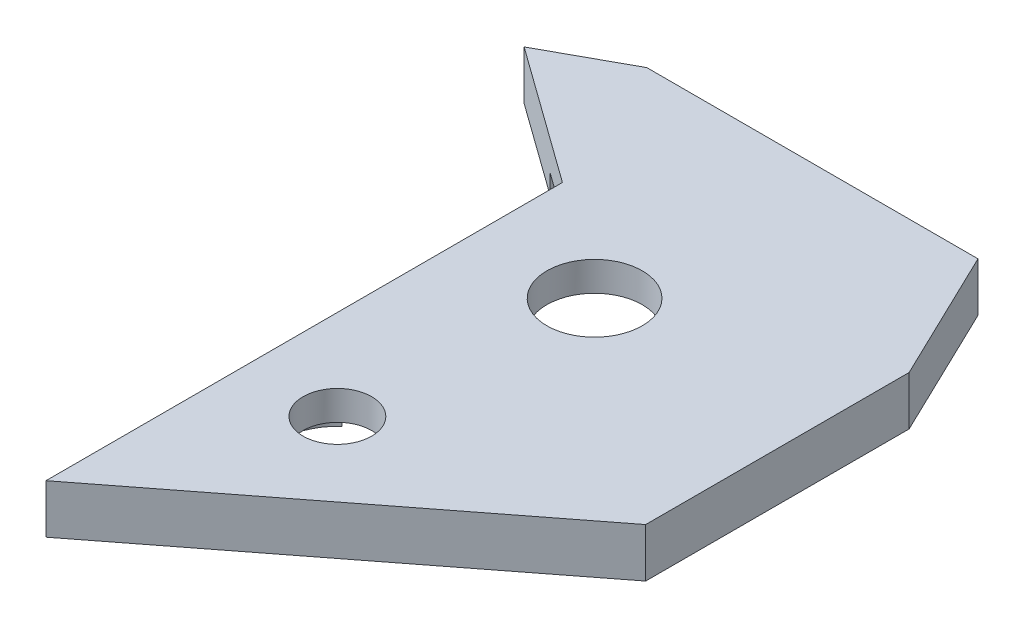
ISO-10303-21;
HEADER;
FILE_DESCRIPTION(('STEP AP214'),'2;1');
FILE_NAME('part.step','',(''),(''),'','','');
FILE_SCHEMA(('AUTOMOTIVE_DESIGN { 1 0 10303 214 1 1 1 1 }'));
ENDSEC;
DATA;
#1=APPLICATION_CONTEXT('core data for automotive mechanical design processes');
#2=APPLICATION_PROTOCOL_DEFINITION('international standard','automotive_design',2000,#1);
#3=PRODUCT_CONTEXT('',#1,'mechanical');
#4=PRODUCT('Part','Part','',(#3));
#5=PRODUCT_RELATED_PRODUCT_CATEGORY('part','',(#4));
#6=PRODUCT_DEFINITION_FORMATION('','',#4);
#7=PRODUCT_DEFINITION_CONTEXT('part definition',#1,'design');
#8=PRODUCT_DEFINITION('design','',#6,#7);
#9=PRODUCT_DEFINITION_SHAPE('','',#8);
#10=(LENGTH_UNIT() NAMED_UNIT(*) SI_UNIT(.MILLI.,.METRE.));
#11=(NAMED_UNIT(*) PLANE_ANGLE_UNIT() SI_UNIT($,.RADIAN.));
#12=(NAMED_UNIT(*) SI_UNIT($,.STERADIAN.) SOLID_ANGLE_UNIT());
#13=UNCERTAINTY_MEASURE_WITH_UNIT(LENGTH_MEASURE(1.E-05),#10,'distance_accuracy_value','');
#14=(GEOMETRIC_REPRESENTATION_CONTEXT(3) GLOBAL_UNCERTAINTY_ASSIGNED_CONTEXT((#13)) GLOBAL_UNIT_ASSIGNED_CONTEXT((#10,
#11,#12)) REPRESENTATION_CONTEXT('',''));
#15=CARTESIAN_POINT('',(0.,0.,0.));
#16=DIRECTION('',(0.,0.,1.));
#17=DIRECTION('',(1.,0.,0.));
#18=AXIS2_PLACEMENT_3D('',#15,#16,#17);
#19=CARTESIAN_POINT('',(13.9493304641398,5.,10.0340226701802));
#20=DIRECTION('',(0.583940739874912,0.,-0.811796287447991));
#21=DIRECTION('',(-0.811796287447991,0.,-0.583940739874912));
#22=AXIS2_PLACEMENT_3D('',#19,#20,#21);
#23=PLANE('',#22);
#24=DIRECTION('',(0.811796287447991,0.,0.583940739874912));
#25=VECTOR('',#24,1.);
#26=CARTESIAN_POINT('',(13.9493304641398,0.,10.0340226701802));
#27=LINE('',#26,#25);
#28=CARTESIAN_POINT('',(9.93663484827323E-10,0.,5.07614783540333E-10));
#29=VERTEX_POINT('',#28);
#30=CARTESIAN_POINT('',(9.36492016205331,0.,6.73636784583235));
#31=VERTEX_POINT('',#30);
#32=EDGE_CURVE('E132',#29,#31,#27,.T.);
#33=ORIENTED_EDGE('',*,*,#32,.T.);
#34=DIRECTION('',(0.,-1.,0.));
#35=VECTOR('',#34,1.);
#36=CARTESIAN_POINT('',(9.36492016205331,2.,6.73636784583235));
#37=LINE('',#36,#35);
#38=CARTESIAN_POINT('',(9.36492016205331,2.,6.73636784583235));
#39=VERTEX_POINT('',#38);
#40=EDGE_CURVE('E190',#31,#39,#37,.F.);
#41=ORIENTED_EDGE('',*,*,#40,.T.);
#42=DIRECTION('',(-0.811796287447991,0.,-0.583940739874912));
#43=VECTOR('',#42,1.);
#44=CARTESIAN_POINT('',(13.9493304641398,2.,10.0340226701802));
#45=LINE('',#44,#43);
#46=CARTESIAN_POINT('',(13.9493304641398,2.,10.0340226701802));
#47=VERTEX_POINT('',#46);
#48=EDGE_CURVE('E136',#47,#39,#45,.T.);
#49=ORIENTED_EDGE('',*,*,#48,.F.);
#50=DIRECTION('',(0.,-1.,0.));
#51=VECTOR('',#50,1.);
#52=CARTESIAN_POINT('',(13.9493304641398,5.,10.0340226701802));
#53=LINE('',#52,#51);
#54=CARTESIAN_POINT('',(13.9493304641398,5.,10.0340226701802));
#55=VERTEX_POINT('',#54);
#56=EDGE_CURVE('E156',#55,#47,#53,.T.);
#57=ORIENTED_EDGE('',*,*,#56,.F.);
#58=DIRECTION('',(0.811796287447991,0.,0.583940739874912));
#59=VECTOR('',#58,1.);
#60=CARTESIAN_POINT('',(13.9493304641398,5.,10.0340226701802));
#61=LINE('',#60,#59);
#62=CARTESIAN_POINT('',(9.93663484827323E-10,5.,5.07614783540333E-10));
#63=VERTEX_POINT('',#62);
#64=EDGE_CURVE('E146',#63,#55,#61,.T.);
#65=ORIENTED_EDGE('',*,*,#64,.F.);
#66=DIRECTION('',(0.,-1.,0.));
#67=VECTOR('',#66,1.);
#68=CARTESIAN_POINT('',(9.93663484827323E-10,5.,5.07614783540333E-10));
#69=LINE('',#68,#67);
#70=EDGE_CURVE('E128',#63,#29,#69,.T.);
#71=ORIENTED_EDGE('',*,*,#70,.T.);
#72=EDGE_LOOP('',(#33,#41,#49,#57,#65,#71));
#73=FACE_BOUND('',#72,.T.);
#74=ADVANCED_FACE('F31',(#73),#23,.F.);
#75=CARTESIAN_POINT('',(13.950964490789,5.,62.7882786640328));
#76=DIRECTION('',(0.999999999520296,0.,-3.09743094217024E-05));
#77=DIRECTION('',(-3.09743094217024E-05,0.,-0.999999999520296));
#78=AXIS2_PLACEMENT_3D('',#75,#76,#77);
#79=PLANE('',#78);
#80=DIRECTION('',(-3.09743094217024E-05,0.,-0.999999999520296));
#81=VECTOR('',#80,1.);
#82=CARTESIAN_POINT('',(13.950964490789,2.,62.7882786640328));
#83=LINE('',#82,#81);
#84=CARTESIAN_POINT('',(13.9501074593234,2.,35.1191721938419));
#85=VERTEX_POINT('',#84);
#86=EDGE_CURVE('E11',#85,#47,#83,.T.);
#87=ORIENTED_EDGE('',*,*,#86,.F.);
#88=DIRECTION('',(0.,-1.,0.));
#89=VECTOR('',#88,1.);
#90=CARTESIAN_POINT('',(13.9501074593234,2.,35.1191721938419));
#91=LINE('',#90,#89);
#92=CARTESIAN_POINT('',(13.9501074593234,0.,35.1191721938419));
#93=VERTEX_POINT('',#92);
#94=EDGE_CURVE('E186',#85,#93,#91,.T.);
#95=ORIENTED_EDGE('',*,*,#94,.T.);
#96=DIRECTION('',(3.09743094217024E-05,0.,0.999999999520296));
#97=VECTOR('',#96,1.);
#98=CARTESIAN_POINT('',(13.950964490789,0.,62.7882786640328));
#99=LINE('',#98,#97);
#100=CARTESIAN_POINT('',(13.950964490789,0.,62.7882786640328));
#101=VERTEX_POINT('',#100);
#102=EDGE_CURVE('E135',#93,#101,#99,.T.);
#103=ORIENTED_EDGE('',*,*,#102,.T.);
#104=DIRECTION('',(0.,-1.,0.));
#105=VECTOR('',#104,1.);
#106=CARTESIAN_POINT('',(13.950964490789,5.,62.7882786640328));
#107=LINE('',#106,#105);
#108=CARTESIAN_POINT('',(13.950964490789,5.,62.7882786640328));
#109=VERTEX_POINT('',#108);
#110=EDGE_CURVE('E153',#109,#101,#107,.T.);
#111=ORIENTED_EDGE('',*,*,#110,.F.);
#112=DIRECTION('',(3.09743094217024E-05,0.,0.999999999520296));
#113=VECTOR('',#112,1.);
#114=CARTESIAN_POINT('',(13.950964490789,5.,62.7882786640328));
#115=LINE('',#114,#113);
#116=EDGE_CURVE('E92',#55,#109,#115,.T.);
#117=ORIENTED_EDGE('',*,*,#116,.F.);
#118=ORIENTED_EDGE('',*,*,#56,.T.);
#119=EDGE_LOOP('',(#87,#95,#103,#111,#117,#118));
#120=FACE_BOUND('',#119,.T.);
#121=ADVANCED_FACE('F215',(#120),#79,.F.);
#122=CARTESIAN_POINT('',(48.4615625155491,5.,36.0441629954629));
#123=DIRECTION('',(-0.612548801535928,0.,-0.790432771168363));
#124=DIRECTION('',(-0.790432771168363,0.,0.612548801535928));
#125=AXIS2_PLACEMENT_3D('',#122,#123,#124);
#126=PLANE('',#125);
#127=DIRECTION('',(0.790432771168363,0.,-0.612548801535928));
#128=VECTOR('',#127,1.);
#129=CARTESIAN_POINT('',(48.4615625155491,0.,36.0441629954629));
#130=LINE('',#129,#128);
#131=CARTESIAN_POINT('',(48.4615625155491,0.,36.0441629954629));
#132=VERTEX_POINT('',#131);
#133=EDGE_CURVE('E138',#101,#132,#130,.T.);
#134=ORIENTED_EDGE('',*,*,#133,.T.);
#135=DIRECTION('',(0.,-1.,0.));
#136=VECTOR('',#135,1.);
#137=CARTESIAN_POINT('',(48.4615625155491,5.,36.0441629954629));
#138=LINE('',#137,#136);
#139=CARTESIAN_POINT('',(48.4615625155491,5.,36.0441629954629));
#140=VERTEX_POINT('',#139);
#141=EDGE_CURVE('E150',#140,#132,#138,.T.);
#142=ORIENTED_EDGE('',*,*,#141,.F.);
#143=DIRECTION('',(0.790432771168363,0.,-0.612548801535928));
#144=VECTOR('',#143,1.);
#145=CARTESIAN_POINT('',(48.4615625155491,5.,36.0441629954629));
#146=LINE('',#145,#144);
#147=EDGE_CURVE('E197',#109,#140,#146,.T.);
#148=ORIENTED_EDGE('',*,*,#147,.F.);
#149=ORIENTED_EDGE('',*,*,#110,.T.);
#150=EDGE_LOOP('',(#134,#142,#148,#149));
#151=FACE_BOUND('',#150,.T.);
#152=ADVANCED_FACE('F201',(#151),#126,.F.);
#153=CARTESIAN_POINT('',(48.4615625155491,5.,9.13446865179747));
#154=DIRECTION('',(-1.,0.,0.));
#155=DIRECTION('',(0.,0.,1.));
#156=AXIS2_PLACEMENT_3D('',#153,#154,#155);
#157=PLANE('',#156);
#158=DIRECTION('',(0.,0.,-1.));
#159=VECTOR('',#158,1.);
#160=CARTESIAN_POINT('',(48.4615625155491,0.,9.13446865179747));
#161=LINE('',#160,#159);
#162=CARTESIAN_POINT('',(48.4615625155491,0.,9.13446865179747));
#163=VERTEX_POINT('',#162);
#164=EDGE_CURVE('E140',#132,#163,#161,.T.);
#165=ORIENTED_EDGE('',*,*,#164,.T.);
#166=DIRECTION('',(0.,-1.,0.));
#167=VECTOR('',#166,1.);
#168=CARTESIAN_POINT('',(48.4615625155491,5.,9.13446865179747));
#169=LINE('',#168,#167);
#170=CARTESIAN_POINT('',(48.4615625155491,5.,9.13446865179747));
#171=VERTEX_POINT('',#170);
#172=EDGE_CURVE('E123',#171,#163,#169,.T.);
#173=ORIENTED_EDGE('',*,*,#172,.F.);
#174=DIRECTION('',(0.,0.,-1.));
#175=VECTOR('',#174,1.);
#176=CARTESIAN_POINT('',(48.4615625155491,5.,9.13446865179747));
#177=LINE('',#176,#175);
#178=EDGE_CURVE('E111',#140,#171,#177,.T.);
#179=ORIENTED_EDGE('',*,*,#178,.F.);
#180=ORIENTED_EDGE('',*,*,#141,.T.);
#181=EDGE_LOOP('',(#165,#173,#179,#180));
#182=FACE_BOUND('',#181,.T.);
#183=ADVANCED_FACE('F205',(#182),#157,.F.);
#184=CARTESIAN_POINT('',(41.925316115598,5.,-4.43706444205924));
#185=DIRECTION('',(-0.900954840199999,0.,0.433912866737315));
#186=DIRECTION('',(0.433912866737315,0.,0.900954840199999));
#187=AXIS2_PLACEMENT_3D('',#184,#185,#186);
#188=PLANE('',#187);
#189=DIRECTION('',(-0.433912866737315,0.,-0.900954840199999));
#190=VECTOR('',#189,1.);
#191=CARTESIAN_POINT('',(41.925316115598,0.,-4.43706444205924));
#192=LINE('',#191,#190);
#193=CARTESIAN_POINT('',(41.925316115598,0.,-4.43706444205924));
#194=VERTEX_POINT('',#193);
#195=EDGE_CURVE('E120',#163,#194,#192,.T.);
#196=ORIENTED_EDGE('',*,*,#195,.T.);
#197=DIRECTION('',(0.,-1.,0.));
#198=VECTOR('',#197,1.);
#199=CARTESIAN_POINT('',(41.925316115598,5.,-4.43706444205924));
#200=LINE('',#199,#198);
#201=CARTESIAN_POINT('',(41.925316115598,5.,-4.43706444205924));
#202=VERTEX_POINT('',#201);
#203=EDGE_CURVE('E117',#202,#194,#200,.T.);
#204=ORIENTED_EDGE('',*,*,#203,.F.);
#205=DIRECTION('',(-0.433912866737315,0.,-0.900954840199999));
#206=VECTOR('',#205,1.);
#207=CARTESIAN_POINT('',(41.925316115598,5.,-4.43706444205924));
#208=LINE('',#207,#206);
#209=EDGE_CURVE('E104',#171,#202,#208,.T.);
#210=ORIENTED_EDGE('',*,*,#209,.F.);
#211=ORIENTED_EDGE('',*,*,#172,.T.);
#212=EDGE_LOOP('',(#196,#204,#210,#211));
#213=FACE_BOUND('',#212,.T.);
#214=ADVANCED_FACE('F118',(#213),#188,.F.);
#215=CARTESIAN_POINT('',(8.09699025857752,5.,-4.43706444205924));
#216=DIRECTION('',(0.,0.,1.));
#217=DIRECTION('',(1.,0.,0.));
#218=AXIS2_PLACEMENT_3D('',#215,#216,#217);
#219=PLANE('',#218);
#220=DIRECTION('',(-1.,0.,0.));
#221=VECTOR('',#220,1.);
#222=CARTESIAN_POINT('',(8.09699025857752,0.,-4.43706444205924));
#223=LINE('',#222,#221);
#224=CARTESIAN_POINT('',(8.09699025857752,0.,-4.43706444205924));
#225=VERTEX_POINT('',#224);
#226=EDGE_CURVE('E143',#194,#225,#223,.T.);
#227=ORIENTED_EDGE('',*,*,#226,.T.);
#228=DIRECTION('',(0.,-1.,0.));
#229=VECTOR('',#228,1.);
#230=CARTESIAN_POINT('',(8.09699025857752,5.,-4.43706444205924));
#231=LINE('',#230,#229);
#232=CARTESIAN_POINT('',(8.09699025857752,5.,-4.43706444205924));
#233=VERTEX_POINT('',#232);
#234=EDGE_CURVE('E124',#233,#225,#231,.T.);
#235=ORIENTED_EDGE('',*,*,#234,.F.);
#236=DIRECTION('',(-1.,0.,0.));
#237=VECTOR('',#236,1.);
#238=CARTESIAN_POINT('',(8.09699025857752,5.,-4.43706444205924));
#239=LINE('',#238,#237);
#240=EDGE_CURVE('E108',#202,#233,#239,.T.);
#241=ORIENTED_EDGE('',*,*,#240,.F.);
#242=ORIENTED_EDGE('',*,*,#203,.T.);
#243=EDGE_LOOP('',(#227,#235,#241,#242));
#244=FACE_BOUND('',#243,.T.);
#245=ADVANCED_FACE('F126',(#244),#219,.F.);
#246=CARTESIAN_POINT('',(9.93663484827323E-10,5.,5.07614783540333E-10));
#247=DIRECTION('',(0.480564426491671,0.,0.876959424369641));
#248=DIRECTION('',(0.876959424369641,0.,-0.480564426491671));
#249=AXIS2_PLACEMENT_3D('',#246,#247,#248);
#250=PLANE('',#249);
#251=DIRECTION('',(-0.876959424369641,0.,0.480564426491671));
#252=VECTOR('',#251,1.);
#253=CARTESIAN_POINT('',(9.93663484827323E-10,0.,5.07614783540333E-10));
#254=LINE('',#253,#252);
#255=EDGE_CURVE('E83',#225,#29,#254,.T.);
#256=ORIENTED_EDGE('',*,*,#255,.T.);
#257=ORIENTED_EDGE('',*,*,#70,.F.);
#258=DIRECTION('',(-0.876959424369641,0.,0.480564426491671));
#259=VECTOR('',#258,1.);
#260=CARTESIAN_POINT('',(9.93663484827323E-10,5.,5.07614783540333E-10));
#261=LINE('',#260,#259);
#262=EDGE_CURVE('E56',#233,#63,#261,.T.);
#263=ORIENTED_EDGE('',*,*,#262,.F.);
#264=ORIENTED_EDGE('',*,*,#234,.T.);
#265=EDGE_LOOP('',(#256,#257,#263,#264));
#266=FACE_BOUND('',#265,.T.);
#267=ADVANCED_FACE('F209',(#266),#250,.F.);
#268=CARTESIAN_POINT('',(49.2544735891371,5.,35.4296936242943));
#269=DIRECTION('',(0.,1.,0.));
#270=DIRECTION('',(0.,0.,1.));
#271=AXIS2_PLACEMENT_3D('',#268,#269,#270);
#272=PLANE('',#271);
#273=CARTESIAN_POINT('',(23.1482782556844,5.,42.2208082450932));
#274=DIRECTION('',(0.,1.,0.));
#275=DIRECTION('',(0.,0.,1.));
#276=AXIS2_PLACEMENT_3D('',#273,#274,#275);
#277=CIRCLE('',#276,3.49999999994544);
#278=CARTESIAN_POINT('',(23.1482782556844,5.,45.7208082450387));
#279=VERTEX_POINT('',#278);
#280=EDGE_CURVE('E171',#279,#279,#277,.T.);
#281=ORIENTED_EDGE('',*,*,#280,.F.);
#282=EDGE_LOOP('',(#281));
#283=FACE_BOUND('',#282,.T.);
#284=CARTESIAN_POINT('',(25.8346118225278,5.,18.6374871810098));
#285=DIRECTION('',(0.,1.,0.));
#286=DIRECTION('',(0.,0.,1.));
#287=AXIS2_PLACEMENT_3D('',#284,#285,#286);
#288=CIRCLE('',#287,4.87000000001241);
#289=CARTESIAN_POINT('',(25.8346118225278,5.,23.5074871810222));
#290=VERTEX_POINT('',#289);
#291=EDGE_CURVE('E161',#290,#290,#288,.T.);
#292=ORIENTED_EDGE('',*,*,#291,.F.);
#293=EDGE_LOOP('',(#292));
#294=FACE_BOUND('',#293,.T.);
#295=ORIENTED_EDGE('',*,*,#64,.T.);
#296=ORIENTED_EDGE('',*,*,#116,.T.);
#297=ORIENTED_EDGE('',*,*,#147,.T.);
#298=ORIENTED_EDGE('',*,*,#178,.T.);
#299=ORIENTED_EDGE('',*,*,#209,.T.);
#300=ORIENTED_EDGE('',*,*,#240,.T.);
#301=ORIENTED_EDGE('',*,*,#262,.T.);
#302=EDGE_LOOP('',(#295,#296,#297,#298,#299,#300,#301));
#303=FACE_BOUND('',#302,.T.);
#304=ADVANCED_FACE('F106',(#283,#294,#303),#272,.T.);
#305=CARTESIAN_POINT('',(49.2544735891371,0.,35.4296936242943));
#306=DIRECTION('',(0.,1.,0.));
#307=DIRECTION('',(0.,0.,1.));
#308=AXIS2_PLACEMENT_3D('',#305,#306,#307);
#309=PLANE('',#308);
#310=CARTESIAN_POINT('',(23.1482782556844,0.,42.2208082450932));
#311=DIRECTION('',(0.,-1.,0.));
#312=DIRECTION('',(0.,0.,-1.));
#313=AXIS2_PLACEMENT_3D('',#310,#311,#312);
#314=CIRCLE('',#313,5.8301870830896);
#315=CARTESIAN_POINT('',(27.9061303686052,0.,38.851249713861));
#316=VERTEX_POINT('',#315);
#317=CARTESIAN_POINT('',(19.2701197173842,0.,37.8675373167413));
#318=VERTEX_POINT('',#317);
#319=EDGE_CURVE('E47',#316,#318,#314,.T.);
#320=ORIENTED_EDGE('',*,*,#319,.F.);
#321=CARTESIAN_POINT('',(25.8346118225278,0.,18.6374871810098));
#322=DIRECTION('',(0.,1.,0.));
#323=DIRECTION('',(0.,0.,1.));
#324=AXIS2_PLACEMENT_3D('',#321,#322,#323);
#325=CIRCLE('',#324,20.3196305286597);
#326=EDGE_CURVE('E39',#316,#31,#325,.T.);
#327=ORIENTED_EDGE('',*,*,#326,.T.);
#328=ORIENTED_EDGE('',*,*,#32,.F.);
#329=ORIENTED_EDGE('',*,*,#255,.F.);
#330=ORIENTED_EDGE('',*,*,#226,.F.);
#331=ORIENTED_EDGE('',*,*,#195,.F.);
#332=ORIENTED_EDGE('',*,*,#164,.F.);
#333=ORIENTED_EDGE('',*,*,#133,.F.);
#334=ORIENTED_EDGE('',*,*,#102,.F.);
#335=CARTESIAN_POINT('',(25.8346118225278,0.,18.6374871810098));
#336=DIRECTION('',(0.,-1.,0.));
#337=DIRECTION('',(0.,0.,-1.));
#338=AXIS2_PLACEMENT_3D('',#335,#336,#337);
#339=CIRCLE('',#338,20.3196305286597);
#340=EDGE_CURVE('E164',#318,#93,#339,.T.);
#341=ORIENTED_EDGE('',*,*,#340,.F.);
#342=EDGE_LOOP('',(#320,#327,#328,#329,#330,#331,#332,#333,#334,#341));
#343=FACE_BOUND('',#342,.T.);
#344=ADVANCED_FACE('F207',(#343),#309,.F.);
#345=CARTESIAN_POINT('',(24.4914450391061,2.,30.4291477130515));
#346=DIRECTION('',(0.,-1.,0.));
#347=DIRECTION('',(0.,0.,-1.));
#348=AXIS2_PLACEMENT_3D('',#345,#346,#347);
#349=PLANE('',#348);
#350=CARTESIAN_POINT('',(23.1482782556844,2.,42.2208082450932));
#351=DIRECTION('',(0.,-1.,0.));
#352=DIRECTION('',(0.,0.,-1.));
#353=AXIS2_PLACEMENT_3D('',#350,#351,#352);
#354=CIRCLE('',#353,3.49999999994544);
#355=CARTESIAN_POINT('',(23.1482782556844,2.,38.7208082451478));
#356=VERTEX_POINT('',#355);
#357=EDGE_CURVE('E34',#356,#356,#354,.T.);
#358=ORIENTED_EDGE('',*,*,#357,.F.);
#359=EDGE_LOOP('',(#358));
#360=FACE_BOUND('',#359,.T.);
#361=CARTESIAN_POINT('',(25.8346118225278,2.,18.6374871810098));
#362=DIRECTION('',(0.,-1.,0.));
#363=DIRECTION('',(0.,0.,-1.));
#364=AXIS2_PLACEMENT_3D('',#361,#362,#363);
#365=CIRCLE('',#364,4.87000000001241);
#366=CARTESIAN_POINT('',(25.8346118225278,2.,13.7674871809974));
#367=VERTEX_POINT('',#366);
#368=EDGE_CURVE('E159',#367,#367,#365,.T.);
#369=ORIENTED_EDGE('',*,*,#368,.F.);
#370=EDGE_LOOP('',(#369));
#371=FACE_BOUND('',#370,.T.);
#372=ORIENTED_EDGE('',*,*,#48,.T.);
#373=CARTESIAN_POINT('',(25.8346118225278,2.,18.6374871810098));
#374=DIRECTION('',(0.,-1.,0.));
#375=DIRECTION('',(0.,0.,-1.));
#376=AXIS2_PLACEMENT_3D('',#373,#374,#375);
#377=CIRCLE('',#376,20.3196305286597);
#378=CARTESIAN_POINT('',(27.9061303686052,2.,38.851249713861));
#379=VERTEX_POINT('',#378);
#380=EDGE_CURVE('E177',#39,#379,#377,.T.);
#381=ORIENTED_EDGE('',*,*,#380,.T.);
#382=CARTESIAN_POINT('',(23.1482782556844,2.,42.2208082450932));
#383=DIRECTION('',(0.,-1.,0.));
#384=DIRECTION('',(0.,0.,-1.));
#385=AXIS2_PLACEMENT_3D('',#382,#383,#384);
#386=CIRCLE('',#385,5.8301870830896);
#387=CARTESIAN_POINT('',(19.2701197173842,2.,37.8675373167413));
#388=VERTEX_POINT('',#387);
#389=EDGE_CURVE('E174',#379,#388,#386,.T.);
#390=ORIENTED_EDGE('',*,*,#389,.T.);
#391=EDGE_CURVE('E178',#388,#85,#377,.T.);
#392=ORIENTED_EDGE('',*,*,#391,.T.);
#393=ORIENTED_EDGE('',*,*,#86,.T.);
#394=EDGE_LOOP('',(#372,#381,#390,#392,#393));
#395=FACE_BOUND('',#394,.T.);
#396=ADVANCED_FACE('F240',(#360,#371,#395),#349,.T.);
#397=CARTESIAN_POINT('',(25.8346118225278,2.,18.6374871810098));
#398=DIRECTION('',(0.,-1.,0.));
#399=DIRECTION('',(0.,0.,-1.));
#400=AXIS2_PLACEMENT_3D('',#397,#398,#399);
#401=CYLINDRICAL_SURFACE('',#400,20.3196305286597);
#402=ORIENTED_EDGE('',*,*,#326,.F.);
#403=DIRECTION('',(0.,-1.,0.));
#404=VECTOR('',#403,1.);
#405=CARTESIAN_POINT('',(27.9061303686052,2.,38.851249713861));
#406=LINE('',#405,#404);
#407=EDGE_CURVE('E184',#379,#316,#406,.T.);
#408=ORIENTED_EDGE('',*,*,#407,.F.);
#409=ORIENTED_EDGE('',*,*,#380,.F.);
#410=ORIENTED_EDGE('',*,*,#40,.F.);
#411=EDGE_LOOP('',(#402,#408,#409,#410));
#412=FACE_BOUND('',#411,.T.);
#413=ADVANCED_FACE('F245',(#412),#401,.F.);
#414=ORIENTED_EDGE('',*,*,#391,.F.);
#415=DIRECTION('',(0.,-1.,0.));
#416=VECTOR('',#415,1.);
#417=CARTESIAN_POINT('',(19.2701197173842,2.,37.8675373167413));
#418=LINE('',#417,#416);
#419=EDGE_CURVE('E180',#388,#318,#418,.T.);
#420=ORIENTED_EDGE('',*,*,#419,.T.);
#421=ORIENTED_EDGE('',*,*,#340,.T.);
#422=ORIENTED_EDGE('',*,*,#94,.F.);
#423=EDGE_LOOP('',(#414,#420,#421,#422));
#424=FACE_BOUND('',#423,.T.);
#425=ADVANCED_FACE('F242',(#424),#401,.F.);
#426=CARTESIAN_POINT('',(23.1482782556844,2.,42.2208082450932));
#427=DIRECTION('',(0.,-1.,0.));
#428=DIRECTION('',(0.,0.,-1.));
#429=AXIS2_PLACEMENT_3D('',#426,#427,#428);
#430=CYLINDRICAL_SURFACE('',#429,5.8301870830896);
#431=ORIENTED_EDGE('',*,*,#319,.T.);
#432=ORIENTED_EDGE('',*,*,#419,.F.);
#433=ORIENTED_EDGE('',*,*,#389,.F.);
#434=ORIENTED_EDGE('',*,*,#407,.T.);
#435=EDGE_LOOP('',(#431,#432,#433,#434));
#436=FACE_BOUND('',#435,.T.);
#437=ADVANCED_FACE('F236',(#436),#430,.F.);
#438=CARTESIAN_POINT('',(25.8346118225278,0.,18.6374871810098));
#439=DIRECTION('',(0.,1.,0.));
#440=DIRECTION('',(0.,0.,1.));
#441=AXIS2_PLACEMENT_3D('',#438,#439,#440);
#442=CYLINDRICAL_SURFACE('',#441,4.87000000001241);
#443=ORIENTED_EDGE('',*,*,#368,.T.);
#444=EDGE_LOOP('',(#443));
#445=FACE_BOUND('',#444,.T.);
#446=ORIENTED_EDGE('',*,*,#291,.T.);
#447=EDGE_LOOP('',(#446));
#448=FACE_BOUND('',#447,.T.);
#449=ADVANCED_FACE('F277',(#445,#448),#442,.F.);
#450=CARTESIAN_POINT('',(23.1482782556844,0.,42.2208082450932));
#451=DIRECTION('',(0.,1.,0.));
#452=DIRECTION('',(0.,0.,1.));
#453=AXIS2_PLACEMENT_3D('',#450,#451,#452);
#454=CYLINDRICAL_SURFACE('',#453,3.49999999994544);
#455=ORIENTED_EDGE('',*,*,#357,.T.);
#456=EDGE_LOOP('',(#455));
#457=FACE_BOUND('',#456,.T.);
#458=ORIENTED_EDGE('',*,*,#280,.T.);
#459=EDGE_LOOP('',(#458));
#460=FACE_BOUND('',#459,.T.);
#461=ADVANCED_FACE('F281',(#457,#460),#454,.F.);
#462=CLOSED_SHELL('',(#74,#121,#152,#183,#214,#245,#267,#304,#344,#396,#413,#425,#437,#449,#461));
#463=MANIFOLD_SOLID_BREP('B2',#462);
#464=ADVANCED_BREP_SHAPE_REPRESENTATION('',(#18,#463),#14);
#465=SHAPE_DEFINITION_REPRESENTATION(#9,#464);
ENDSEC;
END-ISO-10303-21;
